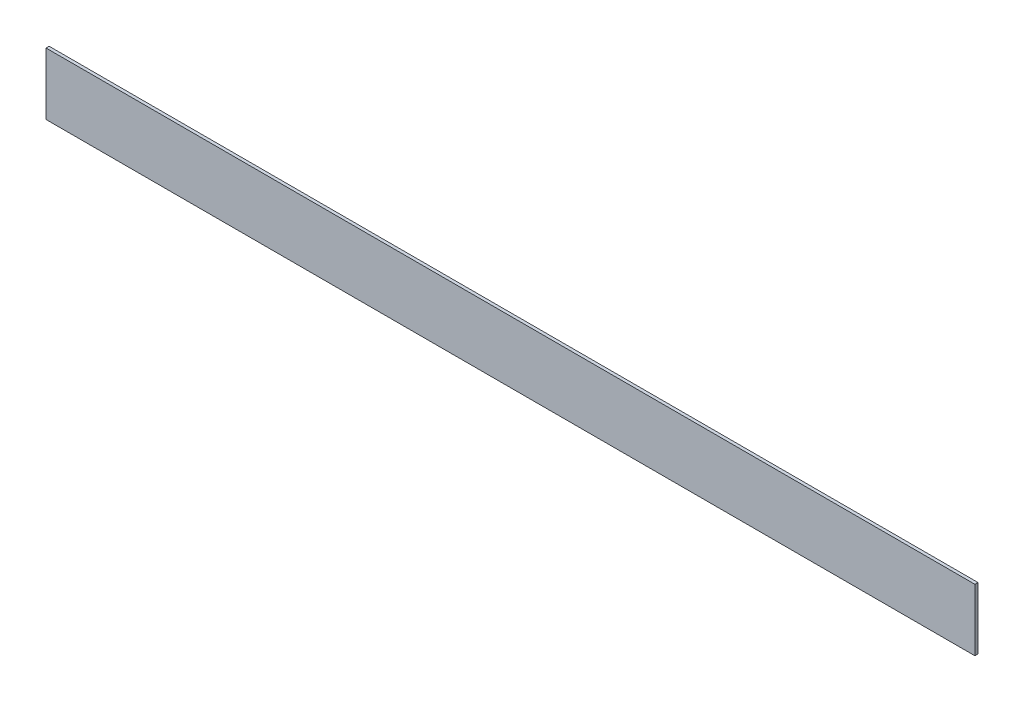
ISO-10303-21;
HEADER;
FILE_DESCRIPTION(('STEP AP214'),'2;1');
FILE_NAME('part.step','',(''),(''),'','','');
FILE_SCHEMA(('AUTOMOTIVE_DESIGN { 1 0 10303 214 1 1 1 1 }'));
ENDSEC;
DATA;
#1=APPLICATION_CONTEXT('core data for automotive mechanical design processes');
#2=APPLICATION_PROTOCOL_DEFINITION('international standard','automotive_design',2000,#1);
#3=PRODUCT_CONTEXT('',#1,'mechanical');
#4=PRODUCT('Part','Part','',(#3));
#5=PRODUCT_RELATED_PRODUCT_CATEGORY('part','',(#4));
#6=PRODUCT_DEFINITION_FORMATION('','',#4);
#7=PRODUCT_DEFINITION_CONTEXT('part definition',#1,'design');
#8=PRODUCT_DEFINITION('design','',#6,#7);
#9=PRODUCT_DEFINITION_SHAPE('','',#8);
#10=(LENGTH_UNIT() NAMED_UNIT(*) SI_UNIT(.MILLI.,.METRE.));
#11=(NAMED_UNIT(*) PLANE_ANGLE_UNIT() SI_UNIT($,.RADIAN.));
#12=(NAMED_UNIT(*) SI_UNIT($,.STERADIAN.) SOLID_ANGLE_UNIT());
#13=UNCERTAINTY_MEASURE_WITH_UNIT(LENGTH_MEASURE(1.E-05),#10,'distance_accuracy_value','');
#14=(GEOMETRIC_REPRESENTATION_CONTEXT(3) GLOBAL_UNCERTAINTY_ASSIGNED_CONTEXT((#13)) GLOBAL_UNIT_ASSIGNED_CONTEXT((#10,
#11,#12)) REPRESENTATION_CONTEXT('',''));
#15=CARTESIAN_POINT('',(0.,0.,0.));
#16=DIRECTION('',(0.,0.,1.));
#17=DIRECTION('',(1.,0.,0.));
#18=AXIS2_PLACEMENT_3D('',#15,#16,#17);
#19=CARTESIAN_POINT('',(1500.,100.,10.));
#20=DIRECTION('',(-1.,0.,0.));
#21=DIRECTION('',(0.,0.,1.));
#22=AXIS2_PLACEMENT_3D('',#19,#20,#21);
#23=PLANE('',#22);
#24=DIRECTION('',(0.,1.,0.));
#25=VECTOR('',#24,1.);
#26=CARTESIAN_POINT('',(1500.,100.,0.));
#27=LINE('',#26,#25);
#28=CARTESIAN_POINT('',(1500.,-100.,0.));
#29=VERTEX_POINT('',#28);
#30=CARTESIAN_POINT('',(1500.,100.,0.));
#31=VERTEX_POINT('',#30);
#32=EDGE_CURVE('E113',#29,#31,#27,.T.);
#33=ORIENTED_EDGE('',*,*,#32,.T.);
#34=DIRECTION('',(0.,0.,-1.));
#35=VECTOR('',#34,1.);
#36=CARTESIAN_POINT('',(1500.,100.,10.));
#37=LINE('',#36,#35);
#38=CARTESIAN_POINT('',(1500.,100.,10.));
#39=VERTEX_POINT('',#38);
#40=EDGE_CURVE('E11',#39,#31,#37,.T.);
#41=ORIENTED_EDGE('',*,*,#40,.F.);
#42=DIRECTION('',(0.,1.,0.));
#43=VECTOR('',#42,1.);
#44=CARTESIAN_POINT('',(1500.,100.,10.));
#45=LINE('',#44,#43);
#46=CARTESIAN_POINT('',(1500.,-100.,10.));
#47=VERTEX_POINT('',#46);
#48=EDGE_CURVE('E97',#47,#39,#45,.T.);
#49=ORIENTED_EDGE('',*,*,#48,.F.);
#50=DIRECTION('',(0.,0.,-1.));
#51=VECTOR('',#50,1.);
#52=CARTESIAN_POINT('',(1500.,-100.,10.));
#53=LINE('',#52,#51);
#54=EDGE_CURVE('E109',#47,#29,#53,.T.);
#55=ORIENTED_EDGE('',*,*,#54,.T.);
#56=EDGE_LOOP('',(#33,#41,#49,#55));
#57=FACE_BOUND('',#56,.T.);
#58=ADVANCED_FACE('F45',(#57),#23,.F.);
#59=CARTESIAN_POINT('',(-1500.,100.,10.));
#60=DIRECTION('',(0.,-1.,0.));
#61=DIRECTION('',(0.,0.,-1.));
#62=AXIS2_PLACEMENT_3D('',#59,#60,#61);
#63=PLANE('',#62);
#64=DIRECTION('',(-1.,0.,0.));
#65=VECTOR('',#64,1.);
#66=CARTESIAN_POINT('',(-1500.,100.,0.));
#67=LINE('',#66,#65);
#68=CARTESIAN_POINT('',(-1500.,100.,0.));
#69=VERTEX_POINT('',#68);
#70=EDGE_CURVE('E102',#31,#69,#67,.T.);
#71=ORIENTED_EDGE('',*,*,#70,.T.);
#72=DIRECTION('',(0.,0.,-1.));
#73=VECTOR('',#72,1.);
#74=CARTESIAN_POINT('',(-1500.,100.,10.));
#75=LINE('',#74,#73);
#76=CARTESIAN_POINT('',(-1500.,100.,10.));
#77=VERTEX_POINT('',#76);
#78=EDGE_CURVE('E54',#77,#69,#75,.T.);
#79=ORIENTED_EDGE('',*,*,#78,.F.);
#80=DIRECTION('',(-1.,0.,0.));
#81=VECTOR('',#80,1.);
#82=CARTESIAN_POINT('',(-1500.,100.,10.));
#83=LINE('',#82,#81);
#84=EDGE_CURVE('E92',#39,#77,#83,.T.);
#85=ORIENTED_EDGE('',*,*,#84,.F.);
#86=ORIENTED_EDGE('',*,*,#40,.T.);
#87=EDGE_LOOP('',(#71,#79,#85,#86));
#88=FACE_BOUND('',#87,.T.);
#89=ADVANCED_FACE('F101',(#88),#63,.F.);
#90=CARTESIAN_POINT('',(-1500.,100.,10.));
#91=DIRECTION('',(1.,0.,0.));
#92=DIRECTION('',(0.,0.,-1.));
#93=AXIS2_PLACEMENT_3D('',#90,#91,#92);
#94=PLANE('',#93);
#95=DIRECTION('',(0.,-1.,0.));
#96=VECTOR('',#95,1.);
#97=CARTESIAN_POINT('',(-1500.,100.,0.));
#98=LINE('',#97,#96);
#99=CARTESIAN_POINT('',(-1500.,-100.,0.));
#100=VERTEX_POINT('',#99);
#101=EDGE_CURVE('E79',#69,#100,#98,.T.);
#102=ORIENTED_EDGE('',*,*,#101,.T.);
#103=DIRECTION('',(0.,0.,-1.));
#104=VECTOR('',#103,1.);
#105=CARTESIAN_POINT('',(-1500.,-100.,10.));
#106=LINE('',#105,#104);
#107=CARTESIAN_POINT('',(-1500.,-100.,10.));
#108=VERTEX_POINT('',#107);
#109=EDGE_CURVE('E104',#108,#100,#106,.T.);
#110=ORIENTED_EDGE('',*,*,#109,.F.);
#111=DIRECTION('',(0.,-1.,0.));
#112=VECTOR('',#111,1.);
#113=CARTESIAN_POINT('',(-1500.,100.,10.));
#114=LINE('',#113,#112);
#115=EDGE_CURVE('E95',#77,#108,#114,.T.);
#116=ORIENTED_EDGE('',*,*,#115,.F.);
#117=ORIENTED_EDGE('',*,*,#78,.T.);
#118=EDGE_LOOP('',(#102,#110,#116,#117));
#119=FACE_BOUND('',#118,.T.);
#120=ADVANCED_FACE('F105',(#119),#94,.F.);
#121=CARTESIAN_POINT('',(-1500.,-100.,10.));
#122=DIRECTION('',(0.,1.,0.));
#123=DIRECTION('',(0.,0.,1.));
#124=AXIS2_PLACEMENT_3D('',#121,#122,#123);
#125=PLANE('',#124);
#126=DIRECTION('',(1.,0.,0.));
#127=VECTOR('',#126,1.);
#128=CARTESIAN_POINT('',(-1500.,-100.,0.));
#129=LINE('',#128,#127);
#130=EDGE_CURVE('E85',#100,#29,#129,.T.);
#131=ORIENTED_EDGE('',*,*,#130,.T.);
#132=ORIENTED_EDGE('',*,*,#54,.F.);
#133=DIRECTION('',(1.,0.,0.));
#134=VECTOR('',#133,1.);
#135=CARTESIAN_POINT('',(-1500.,-100.,10.));
#136=LINE('',#135,#134);
#137=EDGE_CURVE('E62',#108,#47,#136,.T.);
#138=ORIENTED_EDGE('',*,*,#137,.F.);
#139=ORIENTED_EDGE('',*,*,#109,.T.);
#140=EDGE_LOOP('',(#131,#132,#138,#139));
#141=FACE_BOUND('',#140,.T.);
#142=ADVANCED_FACE('F126',(#141),#125,.F.);
#143=CARTESIAN_POINT('',(0.,0.,10.));
#144=DIRECTION('',(0.,0.,1.));
#145=DIRECTION('',(1.,0.,0.));
#146=AXIS2_PLACEMENT_3D('',#143,#144,#145);
#147=PLANE('',#146);
#148=ORIENTED_EDGE('',*,*,#48,.T.);
#149=ORIENTED_EDGE('',*,*,#84,.T.);
#150=ORIENTED_EDGE('',*,*,#115,.T.);
#151=ORIENTED_EDGE('',*,*,#137,.T.);
#152=EDGE_LOOP('',(#148,#149,#150,#151));
#153=FACE_BOUND('',#152,.T.);
#154=ADVANCED_FACE('F93',(#153),#147,.T.);
#155=CARTESIAN_POINT('',(0.,0.,0.));
#156=DIRECTION('',(0.,0.,1.));
#157=DIRECTION('',(1.,0.,0.));
#158=AXIS2_PLACEMENT_3D('',#155,#156,#157);
#159=PLANE('',#158);
#160=ORIENTED_EDGE('',*,*,#32,.F.);
#161=ORIENTED_EDGE('',*,*,#130,.F.);
#162=ORIENTED_EDGE('',*,*,#101,.F.);
#163=ORIENTED_EDGE('',*,*,#70,.F.);
#164=EDGE_LOOP('',(#160,#161,#162,#163));
#165=FACE_BOUND('',#164,.T.);
#166=ADVANCED_FACE('F129',(#165),#159,.F.);
#167=CLOSED_SHELL('',(#58,#89,#120,#142,#154,#166));
#168=MANIFOLD_SOLID_BREP('B2',#167);
#169=ADVANCED_BREP_SHAPE_REPRESENTATION('',(#18,#168),#14);
#170=SHAPE_DEFINITION_REPRESENTATION(#9,#169);
ENDSEC;
END-ISO-10303-21;
